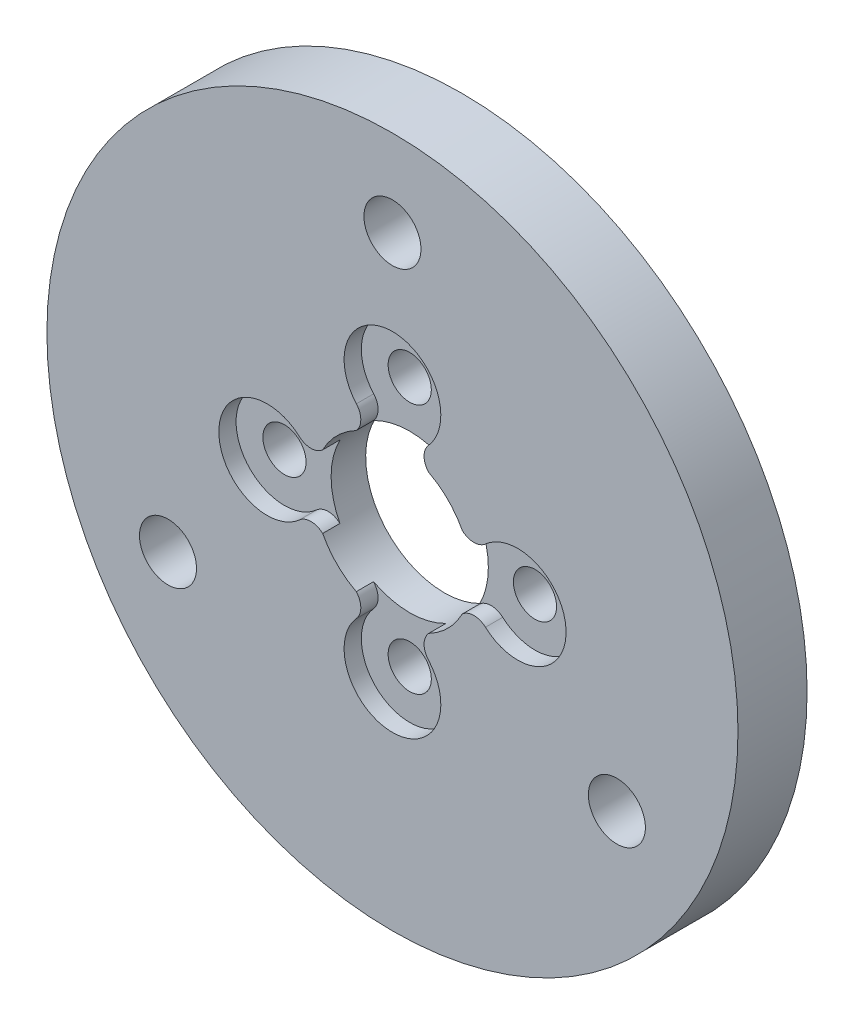
ISO-10303-21;
HEADER;
FILE_DESCRIPTION(('STEP AP214'),'2;1');
FILE_NAME('part.step','',(''),(''),'','','');
FILE_SCHEMA(('AUTOMOTIVE_DESIGN { 1 0 10303 214 1 1 1 1 }'));
ENDSEC;
DATA;
#1=APPLICATION_CONTEXT('core data for automotive mechanical design processes');
#2=APPLICATION_PROTOCOL_DEFINITION('international standard','automotive_design',2000,#1);
#3=PRODUCT_CONTEXT('',#1,'mechanical');
#4=PRODUCT('Part','Part','',(#3));
#5=PRODUCT_RELATED_PRODUCT_CATEGORY('part','',(#4));
#6=PRODUCT_DEFINITION_FORMATION('','',#4);
#7=PRODUCT_DEFINITION_CONTEXT('part definition',#1,'design');
#8=PRODUCT_DEFINITION('design','',#6,#7);
#9=PRODUCT_DEFINITION_SHAPE('','',#8);
#10=(LENGTH_UNIT() NAMED_UNIT(*) SI_UNIT(.MILLI.,.METRE.));
#11=(NAMED_UNIT(*) PLANE_ANGLE_UNIT() SI_UNIT($,.RADIAN.));
#12=(NAMED_UNIT(*) SI_UNIT($,.STERADIAN.) SOLID_ANGLE_UNIT());
#13=UNCERTAINTY_MEASURE_WITH_UNIT(LENGTH_MEASURE(1.E-05),#10,'distance_accuracy_value','');
#14=(GEOMETRIC_REPRESENTATION_CONTEXT(3) GLOBAL_UNCERTAINTY_ASSIGNED_CONTEXT((#13)) GLOBAL_UNIT_ASSIGNED_CONTEXT((#10,
#11,#12)) REPRESENTATION_CONTEXT('',''));
#15=CARTESIAN_POINT('',(0.,0.,0.));
#16=DIRECTION('',(0.,0.,1.));
#17=DIRECTION('',(1.,0.,0.));
#18=AXIS2_PLACEMENT_3D('',#15,#16,#17);
#19=CARTESIAN_POINT('',(0.,0.,3.));
#20=DIRECTION('',(0.,0.,-1.));
#21=DIRECTION('',(-1.,0.,0.));
#22=AXIS2_PLACEMENT_3D('',#19,#20,#21);
#23=CYLINDRICAL_SURFACE('',#22,20.);
#24=CARTESIAN_POINT('',(0.,0.,3.));
#25=DIRECTION('',(0.,0.,1.));
#26=DIRECTION('',(1.,0.,0.));
#27=AXIS2_PLACEMENT_3D('',#24,#25,#26);
#28=CIRCLE('',#27,20.);
#29=CARTESIAN_POINT('',(20.,0.,3.));
#30=VERTEX_POINT('',#29);
#31=EDGE_CURVE('E252',#30,#30,#28,.T.);
#32=ORIENTED_EDGE('',*,*,#31,.F.);
#33=EDGE_LOOP('',(#32));
#34=FACE_BOUND('',#33,.T.);
#35=CARTESIAN_POINT('',(0.,0.,-1.));
#36=DIRECTION('',(0.,0.,-1.));
#37=DIRECTION('',(-1.,0.,0.));
#38=AXIS2_PLACEMENT_3D('',#35,#36,#37);
#39=CIRCLE('',#38,20.);
#40=CARTESIAN_POINT('',(-20.,0.,-1.));
#41=VERTEX_POINT('',#40);
#42=EDGE_CURVE('E371',#41,#41,#39,.T.);
#43=ORIENTED_EDGE('',*,*,#42,.F.);
#44=EDGE_LOOP('',(#43));
#45=FACE_BOUND('',#44,.T.);
#46=ADVANCED_FACE('F43',(#34,#45),#23,.T.);
#47=CARTESIAN_POINT('',(0.,0.,-1.));
#48=DIRECTION('',(0.,0.,1.));
#49=DIRECTION('',(1.,0.,0.));
#50=AXIS2_PLACEMENT_3D('',#47,#48,#49);
#51=CYLINDRICAL_SURFACE('',#50,9.5);
#52=CARTESIAN_POINT('',(0.,0.,0.));
#53=DIRECTION('',(0.,0.,1.));
#54=DIRECTION('',(1.,0.,0.));
#55=AXIS2_PLACEMENT_3D('',#52,#53,#54);
#56=CIRCLE('',#55,9.5);
#57=CARTESIAN_POINT('',(9.5,0.,0.));
#58=VERTEX_POINT('',#57);
#59=EDGE_CURVE('E287',#58,#58,#56,.F.);
#60=ORIENTED_EDGE('',*,*,#59,.F.);
#61=EDGE_LOOP('',(#60));
#62=FACE_BOUND('',#61,.T.);
#63=CARTESIAN_POINT('',(0.,0.,-1.));
#64=DIRECTION('',(0.,0.,-1.));
#65=DIRECTION('',(-1.,0.,0.));
#66=AXIS2_PLACEMENT_3D('',#63,#64,#65);
#67=CIRCLE('',#66,9.5);
#68=CARTESIAN_POINT('',(-9.5,0.,-1.));
#69=VERTEX_POINT('',#68);
#70=EDGE_CURVE('E292',#69,#69,#67,.T.);
#71=ORIENTED_EDGE('',*,*,#70,.T.);
#72=EDGE_LOOP('',(#71));
#73=FACE_BOUND('',#72,.T.);
#74=ADVANCED_FACE('F342',(#62,#73),#51,.F.);
#75=CARTESIAN_POINT('',(0.,0.,0.));
#76=DIRECTION('',(0.,0.,1.));
#77=DIRECTION('',(1.,0.,0.));
#78=AXIS2_PLACEMENT_3D('',#75,#76,#77);
#79=PLANE('',#78);
#80=CARTESIAN_POINT('',(0.,0.,0.));
#81=DIRECTION('',(0.,0.,1.));
#82=DIRECTION('',(1.,0.,0.));
#83=AXIS2_PLACEMENT_3D('',#80,#81,#82);
#84=CIRCLE('',#83,4.55);
#85=CARTESIAN_POINT('',(4.55,0.,0.));
#86=VERTEX_POINT('',#85);
#87=EDGE_CURVE('E255',#86,#86,#84,.T.);
#88=ORIENTED_EDGE('',*,*,#87,.T.);
#89=EDGE_LOOP('',(#88));
#90=FACE_BOUND('',#89,.T.);
#91=CARTESIAN_POINT('',(-7.25,0.,0.));
#92=DIRECTION('',(0.,0.,1.));
#93=DIRECTION('',(1.,0.,0.));
#94=AXIS2_PLACEMENT_3D('',#91,#92,#93);
#95=CIRCLE('',#94,1.25);
#96=CARTESIAN_POINT('',(-6.,0.,0.));
#97=VERTEX_POINT('',#96);
#98=EDGE_CURVE('E262',#97,#97,#95,.T.);
#99=ORIENTED_EDGE('',*,*,#98,.T.);
#100=EDGE_LOOP('',(#99));
#101=FACE_BOUND('',#100,.T.);
#102=CARTESIAN_POINT('',(0.,-7.25,0.));
#103=DIRECTION('',(0.,0.,1.));
#104=DIRECTION('',(1.,0.,0.));
#105=AXIS2_PLACEMENT_3D('',#102,#103,#104);
#106=CIRCLE('',#105,1.25);
#107=CARTESIAN_POINT('',(1.25,-7.25,0.));
#108=VERTEX_POINT('',#107);
#109=EDGE_CURVE('E265',#108,#108,#106,.T.);
#110=ORIENTED_EDGE('',*,*,#109,.T.);
#111=EDGE_LOOP('',(#110));
#112=FACE_BOUND('',#111,.T.);
#113=CARTESIAN_POINT('',(7.25,0.,0.));
#114=DIRECTION('',(0.,0.,1.));
#115=DIRECTION('',(1.,0.,0.));
#116=AXIS2_PLACEMENT_3D('',#113,#114,#115);
#117=CIRCLE('',#116,1.25);
#118=CARTESIAN_POINT('',(8.5,0.,0.));
#119=VERTEX_POINT('',#118);
#120=EDGE_CURVE('E268',#119,#119,#117,.T.);
#121=ORIENTED_EDGE('',*,*,#120,.T.);
#122=EDGE_LOOP('',(#121));
#123=FACE_BOUND('',#122,.T.);
#124=CARTESIAN_POINT('',(0.,7.25,0.));
#125=DIRECTION('',(0.,0.,1.));
#126=DIRECTION('',(1.,0.,0.));
#127=AXIS2_PLACEMENT_3D('',#124,#125,#126);
#128=CIRCLE('',#127,1.25);
#129=CARTESIAN_POINT('',(1.25,7.25,0.));
#130=VERTEX_POINT('',#129);
#131=EDGE_CURVE('E258',#130,#130,#128,.T.);
#132=ORIENTED_EDGE('',*,*,#131,.T.);
#133=EDGE_LOOP('',(#132));
#134=FACE_BOUND('',#133,.T.);
#135=ORIENTED_EDGE('',*,*,#59,.T.);
#136=EDGE_LOOP('',(#135));
#137=FACE_BOUND('',#136,.T.);
#138=ADVANCED_FACE('F349',(#90,#101,#112,#123,#134,#137),#79,.F.);
#139=CARTESIAN_POINT('',(-7.25,0.,-8.));
#140=DIRECTION('',(0.,0.,1.));
#141=DIRECTION('',(1.,0.,0.));
#142=AXIS2_PLACEMENT_3D('',#139,#140,#141);
#143=CYLINDRICAL_SURFACE('',#142,1.25);
#144=ORIENTED_EDGE('',*,*,#98,.F.);
#145=EDGE_LOOP('',(#144));
#146=FACE_BOUND('',#145,.T.);
#147=CARTESIAN_POINT('',(-7.25,0.,2.));
#148=DIRECTION('',(0.,0.,1.));
#149=DIRECTION('',(1.,0.,0.));
#150=AXIS2_PLACEMENT_3D('',#147,#148,#149);
#151=CIRCLE('',#150,1.25);
#152=CARTESIAN_POINT('',(-6.,0.,2.));
#153=VERTEX_POINT('',#152);
#154=EDGE_CURVE('E309',#153,#153,#151,.T.);
#155=ORIENTED_EDGE('',*,*,#154,.T.);
#156=EDGE_LOOP('',(#155));
#157=FACE_BOUND('',#156,.T.);
#158=ADVANCED_FACE('F473',(#146,#157),#143,.F.);
#159=CARTESIAN_POINT('',(0.,-7.25,-8.));
#160=DIRECTION('',(0.,0.,1.));
#161=DIRECTION('',(1.,0.,0.));
#162=AXIS2_PLACEMENT_3D('',#159,#160,#161);
#163=CYLINDRICAL_SURFACE('',#162,1.25);
#164=ORIENTED_EDGE('',*,*,#109,.F.);
#165=EDGE_LOOP('',(#164));
#166=FACE_BOUND('',#165,.T.);
#167=CARTESIAN_POINT('',(0.,-7.25,2.));
#168=DIRECTION('',(0.,0.,1.));
#169=DIRECTION('',(1.,0.,0.));
#170=AXIS2_PLACEMENT_3D('',#167,#168,#169);
#171=CIRCLE('',#170,1.25);
#172=CARTESIAN_POINT('',(1.25,-7.25,2.));
#173=VERTEX_POINT('',#172);
#174=EDGE_CURVE('E204',#173,#173,#171,.T.);
#175=ORIENTED_EDGE('',*,*,#174,.T.);
#176=EDGE_LOOP('',(#175));
#177=FACE_BOUND('',#176,.T.);
#178=ADVANCED_FACE('F315',(#166,#177),#163,.F.);
#179=CARTESIAN_POINT('',(7.25,0.,-8.));
#180=DIRECTION('',(0.,0.,1.));
#181=DIRECTION('',(1.,0.,0.));
#182=AXIS2_PLACEMENT_3D('',#179,#180,#181);
#183=CYLINDRICAL_SURFACE('',#182,1.25);
#184=ORIENTED_EDGE('',*,*,#120,.F.);
#185=EDGE_LOOP('',(#184));
#186=FACE_BOUND('',#185,.T.);
#187=CARTESIAN_POINT('',(7.25,0.,2.));
#188=DIRECTION('',(0.,0.,1.));
#189=DIRECTION('',(1.,0.,0.));
#190=AXIS2_PLACEMENT_3D('',#187,#188,#189);
#191=CIRCLE('',#190,1.25);
#192=CARTESIAN_POINT('',(8.5,0.,2.));
#193=VERTEX_POINT('',#192);
#194=EDGE_CURVE('E306',#193,#193,#191,.T.);
#195=ORIENTED_EDGE('',*,*,#194,.T.);
#196=EDGE_LOOP('',(#195));
#197=FACE_BOUND('',#196,.T.);
#198=ADVANCED_FACE('F466',(#186,#197),#183,.F.);
#199=CARTESIAN_POINT('',(0.,7.25,-8.));
#200=DIRECTION('',(0.,0.,1.));
#201=DIRECTION('',(1.,0.,0.));
#202=AXIS2_PLACEMENT_3D('',#199,#200,#201);
#203=CYLINDRICAL_SURFACE('',#202,1.25);
#204=ORIENTED_EDGE('',*,*,#131,.F.);
#205=EDGE_LOOP('',(#204));
#206=FACE_BOUND('',#205,.T.);
#207=CARTESIAN_POINT('',(0.,7.25,2.));
#208=DIRECTION('',(0.,0.,1.));
#209=DIRECTION('',(1.,0.,0.));
#210=AXIS2_PLACEMENT_3D('',#207,#208,#209);
#211=CIRCLE('',#210,1.25);
#212=CARTESIAN_POINT('',(1.25,7.25,2.));
#213=VERTEX_POINT('',#212);
#214=EDGE_CURVE('E289',#213,#213,#211,.T.);
#215=ORIENTED_EDGE('',*,*,#214,.T.);
#216=EDGE_LOOP('',(#215));
#217=FACE_BOUND('',#216,.T.);
#218=ADVANCED_FACE('F425',(#206,#217),#203,.F.);
#219=CARTESIAN_POINT('',(0.,0.,3.));
#220=DIRECTION('',(0.,0.,1.));
#221=DIRECTION('',(1.,0.,0.));
#222=AXIS2_PLACEMENT_3D('',#219,#220,#221);
#223=PLANE('',#222);
#224=CARTESIAN_POINT('',(0.,15.,3.));
#225=DIRECTION('',(0.,0.,-1.));
#226=DIRECTION('',(-1.,0.,0.));
#227=AXIS2_PLACEMENT_3D('',#224,#225,#226);
#228=CIRCLE('',#227,1.65);
#229=CARTESIAN_POINT('',(-1.65,15.,3.));
#230=VERTEX_POINT('',#229);
#231=EDGE_CURVE('E373',#230,#230,#228,.T.);
#232=ORIENTED_EDGE('',*,*,#231,.T.);
#233=EDGE_LOOP('',(#232));
#234=FACE_BOUND('',#233,.T.);
#235=CARTESIAN_POINT('',(-12.9903810567701,-7.49999999999797,3.));
#236=DIRECTION('',(0.,0.,-1.));
#237=DIRECTION('',(-1.,0.,0.));
#238=AXIS2_PLACEMENT_3D('',#235,#236,#237);
#239=CIRCLE('',#238,1.65000000000284);
#240=CARTESIAN_POINT('',(-14.6403810567729,-7.49999999999797,3.));
#241=VERTEX_POINT('',#240);
#242=EDGE_CURVE('E385',#241,#241,#239,.T.);
#243=ORIENTED_EDGE('',*,*,#242,.T.);
#244=EDGE_LOOP('',(#243));
#245=FACE_BOUND('',#244,.T.);
#246=CARTESIAN_POINT('',(12.9903810567631,-7.50000000000203,3.));
#247=DIRECTION('',(0.,0.,-1.));
#248=DIRECTION('',(-1.,0.,0.));
#249=AXIS2_PLACEMENT_3D('',#246,#247,#248);
#250=CIRCLE('',#249,1.65000000000408);
#251=CARTESIAN_POINT('',(11.340381056759,-7.50000000000203,3.));
#252=VERTEX_POINT('',#251);
#253=EDGE_CURVE('E379',#252,#252,#250,.T.);
#254=ORIENTED_EDGE('',*,*,#253,.T.);
#255=EDGE_LOOP('',(#254));
#256=FACE_BOUND('',#255,.T.);
#257=CARTESIAN_POINT('',(-4.71534482758621,-2.83116992724845,3.));
#258=DIRECTION('',(0.,0.,-1.));
#259=DIRECTION('',(1.,0.,0.));
#260=AXIS2_PLACEMENT_3D('',#257,#258,#259);
#261=CIRCLE('',#260,1.);
#262=CARTESIAN_POINT('',(-5.38235934664247,-2.08612520955149,3.));
#263=VERTEX_POINT('',#262);
#264=CARTESIAN_POINT('',(-4.03939997136812,-2.09421772299616,3.));
#265=VERTEX_POINT('',#264);
#266=EDGE_CURVE('E202',#263,#265,#261,.T.);
#267=ORIENTED_EDGE('',*,*,#266,.F.);
#268=CARTESIAN_POINT('',(-7.25,0.,3.));
#269=DIRECTION('',(0.,0.,1.));
#270=DIRECTION('',(1.,0.,0.));
#271=AXIS2_PLACEMENT_3D('',#268,#269,#270);
#272=CIRCLE('',#271,2.8);
#273=CARTESIAN_POINT('',(-5.38235934664247,2.08612520955149,3.));
#274=VERTEX_POINT('',#273);
#275=EDGE_CURVE('E226',#274,#263,#272,.T.);
#276=ORIENTED_EDGE('',*,*,#275,.F.);
#277=CARTESIAN_POINT('',(-4.71534482758621,2.83116992724845,3.));
#278=DIRECTION('',(0.,0.,-1.));
#279=DIRECTION('',(-1.,0.,0.));
#280=AXIS2_PLACEMENT_3D('',#277,#278,#279);
#281=CIRCLE('',#280,1.);
#282=CARTESIAN_POINT('',(-4.03939997136812,2.09421772299616,3.));
#283=VERTEX_POINT('',#282);
#284=EDGE_CURVE('E224',#283,#274,#281,.T.);
#285=ORIENTED_EDGE('',*,*,#284,.F.);
#286=CARTESIAN_POINT('',(0.,0.,3.));
#287=DIRECTION('',(0.,0.,1.));
#288=DIRECTION('',(1.,0.,0.));
#289=AXIS2_PLACEMENT_3D('',#286,#287,#288);
#290=CIRCLE('',#289,4.55);
#291=CARTESIAN_POINT('',(-2.09421772299616,4.03939997136812,3.));
#292=VERTEX_POINT('',#291);
#293=EDGE_CURVE('E253',#292,#283,#290,.T.);
#294=ORIENTED_EDGE('',*,*,#293,.F.);
#295=CARTESIAN_POINT('',(-2.83116992724845,4.71534482758621,3.));
#296=DIRECTION('',(0.,0.,-1.));
#297=DIRECTION('',(1.,0.,0.));
#298=AXIS2_PLACEMENT_3D('',#295,#296,#297);
#299=CIRCLE('',#298,1.);
#300=CARTESIAN_POINT('',(-2.08612520955149,5.38235934664247,3.));
#301=VERTEX_POINT('',#300);
#302=EDGE_CURVE('E222',#301,#292,#299,.T.);
#303=ORIENTED_EDGE('',*,*,#302,.F.);
#304=CARTESIAN_POINT('',(0.,7.25,3.));
#305=DIRECTION('',(0.,0.,1.));
#306=DIRECTION('',(1.,0.,0.));
#307=AXIS2_PLACEMENT_3D('',#304,#305,#306);
#308=CIRCLE('',#307,2.8);
#309=CARTESIAN_POINT('',(2.08612520955149,5.38235934664247,3.));
#310=VERTEX_POINT('',#309);
#311=EDGE_CURVE('E219',#310,#301,#308,.T.);
#312=ORIENTED_EDGE('',*,*,#311,.F.);
#313=CARTESIAN_POINT('',(2.83116992724845,4.71534482758621,3.));
#314=DIRECTION('',(0.,0.,-1.));
#315=DIRECTION('',(-1.,0.,0.));
#316=AXIS2_PLACEMENT_3D('',#313,#314,#315);
#317=CIRCLE('',#316,1.);
#318=CARTESIAN_POINT('',(2.09421772299616,4.03939997136812,3.));
#319=VERTEX_POINT('',#318);
#320=EDGE_CURVE('E217',#319,#310,#317,.T.);
#321=ORIENTED_EDGE('',*,*,#320,.F.);
#322=CARTESIAN_POINT('',(4.03939997136812,2.09421772299616,3.));
#323=VERTEX_POINT('',#322);
#324=EDGE_CURVE('E249',#323,#319,#290,.T.);
#325=ORIENTED_EDGE('',*,*,#324,.F.);
#326=CARTESIAN_POINT('',(4.71534482758621,2.83116992724845,3.));
#327=DIRECTION('',(0.,0.,-1.));
#328=DIRECTION('',(1.,0.,0.));
#329=AXIS2_PLACEMENT_3D('',#326,#327,#328);
#330=CIRCLE('',#329,1.);
#331=CARTESIAN_POINT('',(5.38235934664247,2.08612520955149,3.));
#332=VERTEX_POINT('',#331);
#333=EDGE_CURVE('E215',#332,#323,#330,.T.);
#334=ORIENTED_EDGE('',*,*,#333,.F.);
#335=CARTESIAN_POINT('',(7.25,0.,3.));
#336=DIRECTION('',(0.,0.,1.));
#337=DIRECTION('',(1.,0.,0.));
#338=AXIS2_PLACEMENT_3D('',#335,#336,#337);
#339=CIRCLE('',#338,2.8);
#340=CARTESIAN_POINT('',(5.38235934664247,-2.08612520955149,3.));
#341=VERTEX_POINT('',#340);
#342=EDGE_CURVE('E212',#341,#332,#339,.T.);
#343=ORIENTED_EDGE('',*,*,#342,.F.);
#344=CARTESIAN_POINT('',(4.71534482758621,-2.83116992724845,3.));
#345=DIRECTION('',(0.,0.,-1.));
#346=DIRECTION('',(-1.,0.,0.));
#347=AXIS2_PLACEMENT_3D('',#344,#345,#346);
#348=CIRCLE('',#347,1.);
#349=CARTESIAN_POINT('',(4.03939997136812,-2.09421772299616,3.));
#350=VERTEX_POINT('',#349);
#351=EDGE_CURVE('E210',#350,#341,#348,.T.);
#352=ORIENTED_EDGE('',*,*,#351,.F.);
#353=CARTESIAN_POINT('',(2.09421772299616,-4.03939997136812,3.));
#354=VERTEX_POINT('',#353);
#355=EDGE_CURVE('E254',#354,#350,#290,.T.);
#356=ORIENTED_EDGE('',*,*,#355,.F.);
#357=CARTESIAN_POINT('',(2.83116992724845,-4.71534482758621,3.));
#358=DIRECTION('',(0.,0.,-1.));
#359=DIRECTION('',(-1.,0.,0.));
#360=AXIS2_PLACEMENT_3D('',#357,#358,#359);
#361=CIRCLE('',#360,1.);
#362=CARTESIAN_POINT('',(2.08612520955149,-5.38235934664247,3.));
#363=VERTEX_POINT('',#362);
#364=EDGE_CURVE('E208',#363,#354,#361,.T.);
#365=ORIENTED_EDGE('',*,*,#364,.F.);
#366=CARTESIAN_POINT('',(0.,-7.25,3.));
#367=DIRECTION('',(0.,0.,1.));
#368=DIRECTION('',(1.,0.,0.));
#369=AXIS2_PLACEMENT_3D('',#366,#367,#368);
#370=CIRCLE('',#369,2.8);
#371=CARTESIAN_POINT('',(-2.08612520955149,-5.38235934664247,3.));
#372=VERTEX_POINT('',#371);
#373=EDGE_CURVE('E206',#372,#363,#370,.T.);
#374=ORIENTED_EDGE('',*,*,#373,.F.);
#375=CARTESIAN_POINT('',(-2.83116992724845,-4.71534482758621,3.));
#376=DIRECTION('',(0.,0.,-1.));
#377=DIRECTION('',(1.,0.,0.));
#378=AXIS2_PLACEMENT_3D('',#375,#376,#377);
#379=CIRCLE('',#378,1.);
#380=CARTESIAN_POINT('',(-2.09421772299616,-4.03939997136812,3.));
#381=VERTEX_POINT('',#380);
#382=EDGE_CURVE('E173',#381,#372,#379,.T.);
#383=ORIENTED_EDGE('',*,*,#382,.F.);
#384=EDGE_CURVE('E435',#265,#381,#290,.T.);
#385=ORIENTED_EDGE('',*,*,#384,.F.);
#386=EDGE_LOOP('',(#267,#276,#285,#294,#303,#312,#321,#325,#334,#343,#352,#356,#365,#374,#383,#385));
#387=FACE_BOUND('',#386,.T.);
#388=ORIENTED_EDGE('',*,*,#31,.T.);
#389=EDGE_LOOP('',(#388));
#390=FACE_BOUND('',#389,.T.);
#391=ADVANCED_FACE('F421',(#234,#245,#256,#387,#390),#223,.T.);
#392=CARTESIAN_POINT('',(0.,0.,3.));
#393=DIRECTION('',(0.,0.,-1.));
#394=DIRECTION('',(-1.,0.,0.));
#395=AXIS2_PLACEMENT_3D('',#392,#393,#394);
#396=CYLINDRICAL_SURFACE('',#395,4.55);
#397=DIRECTION('',(0.,0.,1.));
#398=VECTOR('',#397,1.);
#399=CARTESIAN_POINT('',(-2.09421772299616,4.03939997136812,2.5));
#400=LINE('',#399,#398);
#401=CARTESIAN_POINT('',(-2.09421772299616,4.03939997136812,2.));
#402=VERTEX_POINT('',#401);
#403=EDGE_CURVE('E11',#292,#402,#400,.F.);
#404=ORIENTED_EDGE('',*,*,#403,.F.);
#405=ORIENTED_EDGE('',*,*,#293,.T.);
#406=DIRECTION('',(0.,0.,1.));
#407=VECTOR('',#406,1.);
#408=CARTESIAN_POINT('',(-4.03939997136812,2.09421772299616,2.5));
#409=LINE('',#408,#407);
#410=CARTESIAN_POINT('',(-4.03939997136812,2.09421772299616,2.));
#411=VERTEX_POINT('',#410);
#412=EDGE_CURVE('E282',#411,#283,#409,.T.);
#413=ORIENTED_EDGE('',*,*,#412,.F.);
#414=CARTESIAN_POINT('',(0.,0.,2.));
#415=DIRECTION('',(0.,0.,1.));
#416=DIRECTION('',(1.,0.,0.));
#417=AXIS2_PLACEMENT_3D('',#414,#415,#416);
#418=CIRCLE('',#417,4.55);
#419=CARTESIAN_POINT('',(-4.03939997136812,-2.09421772299616,2.));
#420=VERTEX_POINT('',#419);
#421=EDGE_CURVE('E443',#411,#420,#418,.T.);
#422=ORIENTED_EDGE('',*,*,#421,.T.);
#423=DIRECTION('',(0.,0.,1.));
#424=VECTOR('',#423,1.);
#425=CARTESIAN_POINT('',(-4.03939997136812,-2.09421772299616,2.5));
#426=LINE('',#425,#424);
#427=EDGE_CURVE('E284',#265,#420,#426,.F.);
#428=ORIENTED_EDGE('',*,*,#427,.F.);
#429=ORIENTED_EDGE('',*,*,#384,.T.);
#430=DIRECTION('',(0.,0.,1.));
#431=VECTOR('',#430,1.);
#432=CARTESIAN_POINT('',(-2.09421772299616,-4.03939997136812,2.5));
#433=LINE('',#432,#431);
#434=CARTESIAN_POINT('',(-2.09421772299616,-4.03939997136812,2.));
#435=VERTEX_POINT('',#434);
#436=EDGE_CURVE('E277',#435,#381,#433,.T.);
#437=ORIENTED_EDGE('',*,*,#436,.F.);
#438=CARTESIAN_POINT('',(2.09421772299616,-4.03939997136812,2.));
#439=VERTEX_POINT('',#438);
#440=EDGE_CURVE('E165',#435,#439,#418,.T.);
#441=ORIENTED_EDGE('',*,*,#440,.T.);
#442=DIRECTION('',(0.,0.,1.));
#443=VECTOR('',#442,1.);
#444=CARTESIAN_POINT('',(2.09421772299616,-4.03939997136812,2.5));
#445=LINE('',#444,#443);
#446=EDGE_CURVE('E279',#354,#439,#445,.F.);
#447=ORIENTED_EDGE('',*,*,#446,.F.);
#448=ORIENTED_EDGE('',*,*,#355,.T.);
#449=DIRECTION('',(0.,0.,1.));
#450=VECTOR('',#449,1.);
#451=CARTESIAN_POINT('',(4.03939997136812,-2.09421772299616,2.5));
#452=LINE('',#451,#450);
#453=CARTESIAN_POINT('',(4.03939997136812,-2.09421772299616,2.));
#454=VERTEX_POINT('',#453);
#455=EDGE_CURVE('E261',#454,#350,#452,.T.);
#456=ORIENTED_EDGE('',*,*,#455,.F.);
#457=CARTESIAN_POINT('',(4.03939997136812,2.09421772299616,2.));
#458=VERTEX_POINT('',#457);
#459=EDGE_CURVE('E231',#454,#458,#418,.T.);
#460=ORIENTED_EDGE('',*,*,#459,.T.);
#461=DIRECTION('',(0.,0.,1.));
#462=VECTOR('',#461,1.);
#463=CARTESIAN_POINT('',(4.03939997136812,2.09421772299616,2.5));
#464=LINE('',#463,#462);
#465=EDGE_CURVE('E274',#323,#458,#464,.F.);
#466=ORIENTED_EDGE('',*,*,#465,.F.);
#467=ORIENTED_EDGE('',*,*,#324,.T.);
#468=DIRECTION('',(0.,0.,1.));
#469=VECTOR('',#468,1.);
#470=CARTESIAN_POINT('',(2.09421772299616,4.03939997136812,2.5));
#471=LINE('',#470,#469);
#472=CARTESIAN_POINT('',(2.09421772299616,4.03939997136812,2.));
#473=VERTEX_POINT('',#472);
#474=EDGE_CURVE('E52',#473,#319,#471,.T.);
#475=ORIENTED_EDGE('',*,*,#474,.F.);
#476=EDGE_CURVE('E248',#473,#402,#418,.T.);
#477=ORIENTED_EDGE('',*,*,#476,.T.);
#478=EDGE_LOOP('',(#404,#405,#413,#422,#428,#429,#437,#441,#447,#448,#456,#460,#466,#467,#475,#477));
#479=FACE_BOUND('',#478,.T.);
#480=ORIENTED_EDGE('',*,*,#87,.F.);
#481=EDGE_LOOP('',(#480));
#482=FACE_BOUND('',#481,.T.);
#483=ADVANCED_FACE('F424',(#479,#482),#396,.F.);
#484=CARTESIAN_POINT('',(-5.9826724137931,-1.41558496362423,2.));
#485=DIRECTION('',(0.,0.,1.));
#486=DIRECTION('',(1.,0.,0.));
#487=AXIS2_PLACEMENT_3D('',#484,#485,#486);
#488=PLANE('',#487);
#489=ORIENTED_EDGE('',*,*,#214,.F.);
#490=EDGE_LOOP('',(#489));
#491=FACE_BOUND('',#490,.T.);
#492=CARTESIAN_POINT('',(2.83116992724845,4.71534482758621,2.));
#493=DIRECTION('',(0.,0.,-1.));
#494=DIRECTION('',(-1.,0.,0.));
#495=AXIS2_PLACEMENT_3D('',#492,#493,#494);
#496=CIRCLE('',#495,1.);
#497=CARTESIAN_POINT('',(2.08612520955149,5.38235934664247,2.));
#498=VERTEX_POINT('',#497);
#499=EDGE_CURVE('E194',#473,#498,#496,.T.);
#500=ORIENTED_EDGE('',*,*,#499,.T.);
#501=CARTESIAN_POINT('',(0.,7.25,2.));
#502=DIRECTION('',(0.,0.,1.));
#503=DIRECTION('',(1.,0.,0.));
#504=AXIS2_PLACEMENT_3D('',#501,#502,#503);
#505=CIRCLE('',#504,2.8);
#506=CARTESIAN_POINT('',(-2.08612520955149,5.38235934664247,2.));
#507=VERTEX_POINT('',#506);
#508=EDGE_CURVE('E196',#498,#507,#505,.T.);
#509=ORIENTED_EDGE('',*,*,#508,.T.);
#510=CARTESIAN_POINT('',(-2.83116992724845,4.71534482758621,2.));
#511=DIRECTION('',(0.,0.,-1.));
#512=DIRECTION('',(1.,0.,0.));
#513=AXIS2_PLACEMENT_3D('',#510,#511,#512);
#514=CIRCLE('',#513,1.);
#515=EDGE_CURVE('E60',#507,#402,#514,.T.);
#516=ORIENTED_EDGE('',*,*,#515,.T.);
#517=ORIENTED_EDGE('',*,*,#476,.F.);
#518=EDGE_LOOP('',(#500,#509,#516,#517));
#519=FACE_BOUND('',#518,.T.);
#520=ADVANCED_FACE('F337',(#491,#519),#488,.T.);
#521=CARTESIAN_POINT('',(2.83116992724845,4.71534482758621,2.));
#522=DIRECTION('',(0.,0.,1.));
#523=DIRECTION('',(1.,0.,0.));
#524=AXIS2_PLACEMENT_3D('',#521,#522,#523);
#525=CYLINDRICAL_SURFACE('',#524,1.);
#526=ORIENTED_EDGE('',*,*,#474,.T.);
#527=ORIENTED_EDGE('',*,*,#320,.T.);
#528=DIRECTION('',(0.,0.,1.));
#529=VECTOR('',#528,1.);
#530=CARTESIAN_POINT('',(2.08612520955149,5.38235934664247,2.));
#531=LINE('',#530,#529);
#532=EDGE_CURVE('E237',#498,#310,#531,.T.);
#533=ORIENTED_EDGE('',*,*,#532,.F.);
#534=ORIENTED_EDGE('',*,*,#499,.F.);
#535=EDGE_LOOP('',(#526,#527,#533,#534));
#536=FACE_BOUND('',#535,.T.);
#537=ADVANCED_FACE('F482',(#536),#525,.T.);
#538=CARTESIAN_POINT('',(-2.83116992724845,4.71534482758621,2.));
#539=DIRECTION('',(0.,0.,1.));
#540=DIRECTION('',(1.,0.,0.));
#541=AXIS2_PLACEMENT_3D('',#538,#539,#540);
#542=CYLINDRICAL_SURFACE('',#541,1.);
#543=ORIENTED_EDGE('',*,*,#403,.T.);
#544=ORIENTED_EDGE('',*,*,#515,.F.);
#545=DIRECTION('',(0.,0.,1.));
#546=VECTOR('',#545,1.);
#547=CARTESIAN_POINT('',(-2.08612520955149,5.38235934664247,2.));
#548=LINE('',#547,#546);
#549=EDGE_CURVE('E235',#507,#301,#548,.T.);
#550=ORIENTED_EDGE('',*,*,#549,.T.);
#551=ORIENTED_EDGE('',*,*,#302,.T.);
#552=EDGE_LOOP('',(#543,#544,#550,#551));
#553=FACE_BOUND('',#552,.T.);
#554=ADVANCED_FACE('F487',(#553),#542,.T.);
#555=CARTESIAN_POINT('',(0.,7.25,2.));
#556=DIRECTION('',(0.,0.,1.));
#557=DIRECTION('',(1.,0.,0.));
#558=AXIS2_PLACEMENT_3D('',#555,#556,#557);
#559=CYLINDRICAL_SURFACE('',#558,2.8);
#560=ORIENTED_EDGE('',*,*,#311,.T.);
#561=ORIENTED_EDGE('',*,*,#549,.F.);
#562=ORIENTED_EDGE('',*,*,#508,.F.);
#563=ORIENTED_EDGE('',*,*,#532,.T.);
#564=EDGE_LOOP('',(#560,#561,#562,#563));
#565=FACE_BOUND('',#564,.T.);
#566=ADVANCED_FACE('F335',(#565),#559,.F.);
#567=ORIENTED_EDGE('',*,*,#194,.F.);
#568=EDGE_LOOP('',(#567));
#569=FACE_BOUND('',#568,.T.);
#570=CARTESIAN_POINT('',(4.71534482758621,-2.83116992724845,2.));
#571=DIRECTION('',(0.,0.,-1.));
#572=DIRECTION('',(-1.,0.,0.));
#573=AXIS2_PLACEMENT_3D('',#570,#571,#572);
#574=CIRCLE('',#573,1.);
#575=CARTESIAN_POINT('',(5.38235934664247,-2.08612520955149,2.));
#576=VERTEX_POINT('',#575);
#577=EDGE_CURVE('E184',#454,#576,#574,.T.);
#578=ORIENTED_EDGE('',*,*,#577,.T.);
#579=CARTESIAN_POINT('',(7.25,0.,2.));
#580=DIRECTION('',(0.,0.,1.));
#581=DIRECTION('',(1.,0.,0.));
#582=AXIS2_PLACEMENT_3D('',#579,#580,#581);
#583=CIRCLE('',#582,2.8);
#584=CARTESIAN_POINT('',(5.38235934664247,2.08612520955149,2.));
#585=VERTEX_POINT('',#584);
#586=EDGE_CURVE('E189',#576,#585,#583,.T.);
#587=ORIENTED_EDGE('',*,*,#586,.T.);
#588=CARTESIAN_POINT('',(4.71534482758621,2.83116992724845,2.));
#589=DIRECTION('',(0.,0.,-1.));
#590=DIRECTION('',(1.,0.,0.));
#591=AXIS2_PLACEMENT_3D('',#588,#589,#590);
#592=CIRCLE('',#591,1.);
#593=EDGE_CURVE('E192',#585,#458,#592,.T.);
#594=ORIENTED_EDGE('',*,*,#593,.T.);
#595=ORIENTED_EDGE('',*,*,#459,.F.);
#596=EDGE_LOOP('',(#578,#587,#594,#595));
#597=FACE_BOUND('',#596,.T.);
#598=ADVANCED_FACE('F320',(#569,#597),#488,.T.);
#599=CARTESIAN_POINT('',(4.71534482758621,-2.83116992724845,2.));
#600=DIRECTION('',(0.,0.,1.));
#601=DIRECTION('',(1.,0.,0.));
#602=AXIS2_PLACEMENT_3D('',#599,#600,#601);
#603=CYLINDRICAL_SURFACE('',#602,1.);
#604=ORIENTED_EDGE('',*,*,#455,.T.);
#605=ORIENTED_EDGE('',*,*,#351,.T.);
#606=DIRECTION('',(0.,0.,1.));
#607=VECTOR('',#606,1.);
#608=CARTESIAN_POINT('',(5.38235934664247,-2.08612520955149,2.));
#609=LINE('',#608,#607);
#610=EDGE_CURVE('E242',#576,#341,#609,.T.);
#611=ORIENTED_EDGE('',*,*,#610,.F.);
#612=ORIENTED_EDGE('',*,*,#577,.F.);
#613=EDGE_LOOP('',(#604,#605,#611,#612));
#614=FACE_BOUND('',#613,.T.);
#615=ADVANCED_FACE('F334',(#614),#603,.T.);
#616=CARTESIAN_POINT('',(4.71534482758621,2.83116992724845,2.));
#617=DIRECTION('',(0.,0.,1.));
#618=DIRECTION('',(1.,0.,0.));
#619=AXIS2_PLACEMENT_3D('',#616,#617,#618);
#620=CYLINDRICAL_SURFACE('',#619,1.);
#621=ORIENTED_EDGE('',*,*,#465,.T.);
#622=ORIENTED_EDGE('',*,*,#593,.F.);
#623=DIRECTION('',(0.,0.,1.));
#624=VECTOR('',#623,1.);
#625=CARTESIAN_POINT('',(5.38235934664247,2.08612520955149,2.));
#626=LINE('',#625,#624);
#627=EDGE_CURVE('E240',#585,#332,#626,.T.);
#628=ORIENTED_EDGE('',*,*,#627,.T.);
#629=ORIENTED_EDGE('',*,*,#333,.T.);
#630=EDGE_LOOP('',(#621,#622,#628,#629));
#631=FACE_BOUND('',#630,.T.);
#632=ADVANCED_FACE('F328',(#631),#620,.T.);
#633=CARTESIAN_POINT('',(7.25,0.,2.));
#634=DIRECTION('',(0.,0.,1.));
#635=DIRECTION('',(1.,0.,0.));
#636=AXIS2_PLACEMENT_3D('',#633,#634,#635);
#637=CYLINDRICAL_SURFACE('',#636,2.8);
#638=ORIENTED_EDGE('',*,*,#342,.T.);
#639=ORIENTED_EDGE('',*,*,#627,.F.);
#640=ORIENTED_EDGE('',*,*,#586,.F.);
#641=ORIENTED_EDGE('',*,*,#610,.T.);
#642=EDGE_LOOP('',(#638,#639,#640,#641));
#643=FACE_BOUND('',#642,.T.);
#644=ADVANCED_FACE('F318',(#643),#637,.F.);
#645=ORIENTED_EDGE('',*,*,#174,.F.);
#646=EDGE_LOOP('',(#645));
#647=FACE_BOUND('',#646,.T.);
#648=CARTESIAN_POINT('',(-2.83116992724845,-4.71534482758621,2.));
#649=DIRECTION('',(0.,0.,-1.));
#650=DIRECTION('',(1.,0.,0.));
#651=AXIS2_PLACEMENT_3D('',#648,#649,#650);
#652=CIRCLE('',#651,1.);
#653=CARTESIAN_POINT('',(-2.08612520955149,-5.38235934664247,2.));
#654=VERTEX_POINT('',#653);
#655=EDGE_CURVE('E159',#435,#654,#652,.T.);
#656=ORIENTED_EDGE('',*,*,#655,.T.);
#657=CARTESIAN_POINT('',(0.,-7.25,2.));
#658=DIRECTION('',(0.,0.,1.));
#659=DIRECTION('',(1.,0.,0.));
#660=AXIS2_PLACEMENT_3D('',#657,#658,#659);
#661=CIRCLE('',#660,2.8);
#662=CARTESIAN_POINT('',(2.08612520955149,-5.38235934664247,2.));
#663=VERTEX_POINT('',#662);
#664=EDGE_CURVE('E163',#654,#663,#661,.T.);
#665=ORIENTED_EDGE('',*,*,#664,.T.);
#666=CARTESIAN_POINT('',(2.83116992724845,-4.71534482758621,2.));
#667=DIRECTION('',(0.,0.,-1.));
#668=DIRECTION('',(-1.,0.,0.));
#669=AXIS2_PLACEMENT_3D('',#666,#667,#668);
#670=CIRCLE('',#669,1.);
#671=EDGE_CURVE('E182',#663,#439,#670,.T.);
#672=ORIENTED_EDGE('',*,*,#671,.T.);
#673=ORIENTED_EDGE('',*,*,#440,.F.);
#674=EDGE_LOOP('',(#656,#665,#672,#673));
#675=FACE_BOUND('',#674,.T.);
#676=ADVANCED_FACE('F161',(#647,#675),#488,.T.);
#677=CARTESIAN_POINT('',(-2.83116992724845,-4.71534482758621,2.));
#678=DIRECTION('',(0.,0.,1.));
#679=DIRECTION('',(1.,0.,0.));
#680=AXIS2_PLACEMENT_3D('',#677,#678,#679);
#681=CYLINDRICAL_SURFACE('',#680,1.);
#682=ORIENTED_EDGE('',*,*,#436,.T.);
#683=ORIENTED_EDGE('',*,*,#382,.T.);
#684=DIRECTION('',(0.,0.,1.));
#685=VECTOR('',#684,1.);
#686=CARTESIAN_POINT('',(-2.08612520955149,-5.38235934664247,2.));
#687=LINE('',#686,#685);
#688=EDGE_CURVE('E170',#654,#372,#687,.T.);
#689=ORIENTED_EDGE('',*,*,#688,.F.);
#690=ORIENTED_EDGE('',*,*,#655,.F.);
#691=EDGE_LOOP('',(#682,#683,#689,#690));
#692=FACE_BOUND('',#691,.T.);
#693=ADVANCED_FACE('F171',(#692),#681,.T.);
#694=CARTESIAN_POINT('',(2.83116992724845,-4.71534482758621,2.));
#695=DIRECTION('',(0.,0.,1.));
#696=DIRECTION('',(1.,0.,0.));
#697=AXIS2_PLACEMENT_3D('',#694,#695,#696);
#698=CYLINDRICAL_SURFACE('',#697,1.);
#699=ORIENTED_EDGE('',*,*,#446,.T.);
#700=ORIENTED_EDGE('',*,*,#671,.F.);
#701=DIRECTION('',(0.,0.,1.));
#702=VECTOR('',#701,1.);
#703=CARTESIAN_POINT('',(2.08612520955149,-5.38235934664247,2.));
#704=LINE('',#703,#702);
#705=EDGE_CURVE('E177',#663,#363,#704,.T.);
#706=ORIENTED_EDGE('',*,*,#705,.T.);
#707=ORIENTED_EDGE('',*,*,#364,.T.);
#708=EDGE_LOOP('',(#699,#700,#706,#707));
#709=FACE_BOUND('',#708,.T.);
#710=ADVANCED_FACE('F326',(#709),#698,.T.);
#711=CARTESIAN_POINT('',(0.,-7.25,2.));
#712=DIRECTION('',(0.,0.,1.));
#713=DIRECTION('',(1.,0.,0.));
#714=AXIS2_PLACEMENT_3D('',#711,#712,#713);
#715=CYLINDRICAL_SURFACE('',#714,2.8);
#716=ORIENTED_EDGE('',*,*,#373,.T.);
#717=ORIENTED_EDGE('',*,*,#705,.F.);
#718=ORIENTED_EDGE('',*,*,#664,.F.);
#719=ORIENTED_EDGE('',*,*,#688,.T.);
#720=EDGE_LOOP('',(#716,#717,#718,#719));
#721=FACE_BOUND('',#720,.T.);
#722=ADVANCED_FACE('F180',(#721),#715,.F.);
#723=ORIENTED_EDGE('',*,*,#154,.F.);
#724=EDGE_LOOP('',(#723));
#725=FACE_BOUND('',#724,.T.);
#726=CARTESIAN_POINT('',(-4.71534482758621,2.83116992724845,2.));
#727=DIRECTION('',(0.,0.,-1.));
#728=DIRECTION('',(-1.,0.,0.));
#729=AXIS2_PLACEMENT_3D('',#726,#727,#728);
#730=CIRCLE('',#729,1.);
#731=CARTESIAN_POINT('',(-5.38235934664247,2.08612520955149,2.));
#732=VERTEX_POINT('',#731);
#733=EDGE_CURVE('E199',#411,#732,#730,.T.);
#734=ORIENTED_EDGE('',*,*,#733,.T.);
#735=CARTESIAN_POINT('',(-7.25,0.,2.));
#736=DIRECTION('',(0.,0.,1.));
#737=DIRECTION('',(1.,0.,0.));
#738=AXIS2_PLACEMENT_3D('',#735,#736,#737);
#739=CIRCLE('',#738,2.8);
#740=CARTESIAN_POINT('',(-5.38235934664247,-2.08612520955149,2.));
#741=VERTEX_POINT('',#740);
#742=EDGE_CURVE('E178',#732,#741,#739,.T.);
#743=ORIENTED_EDGE('',*,*,#742,.T.);
#744=CARTESIAN_POINT('',(-4.71534482758621,-2.83116992724845,2.));
#745=DIRECTION('',(0.,0.,-1.));
#746=DIRECTION('',(1.,0.,0.));
#747=AXIS2_PLACEMENT_3D('',#744,#745,#746);
#748=CIRCLE('',#747,1.);
#749=EDGE_CURVE('E67',#741,#420,#748,.T.);
#750=ORIENTED_EDGE('',*,*,#749,.T.);
#751=ORIENTED_EDGE('',*,*,#421,.F.);
#752=EDGE_LOOP('',(#734,#743,#750,#751));
#753=FACE_BOUND('',#752,.T.);
#754=ADVANCED_FACE('F321',(#725,#753),#488,.T.);
#755=CARTESIAN_POINT('',(-4.71534482758621,-2.83116992724845,2.));
#756=DIRECTION('',(0.,0.,1.));
#757=DIRECTION('',(1.,0.,0.));
#758=AXIS2_PLACEMENT_3D('',#755,#756,#757);
#759=CYLINDRICAL_SURFACE('',#758,1.);
#760=ORIENTED_EDGE('',*,*,#427,.T.);
#761=ORIENTED_EDGE('',*,*,#749,.F.);
#762=DIRECTION('',(0.,0.,1.));
#763=VECTOR('',#762,1.);
#764=CARTESIAN_POINT('',(-5.38235934664247,-2.08612520955149,2.));
#765=LINE('',#764,#763);
#766=EDGE_CURVE('E229',#741,#263,#765,.T.);
#767=ORIENTED_EDGE('',*,*,#766,.T.);
#768=ORIENTED_EDGE('',*,*,#266,.T.);
#769=EDGE_LOOP('',(#760,#761,#767,#768));
#770=FACE_BOUND('',#769,.T.);
#771=ADVANCED_FACE('F339',(#770),#759,.T.);
#772=CARTESIAN_POINT('',(-7.25,0.,2.));
#773=DIRECTION('',(0.,0.,1.));
#774=DIRECTION('',(1.,0.,0.));
#775=AXIS2_PLACEMENT_3D('',#772,#773,#774);
#776=CYLINDRICAL_SURFACE('',#775,2.8);
#777=ORIENTED_EDGE('',*,*,#275,.T.);
#778=ORIENTED_EDGE('',*,*,#766,.F.);
#779=ORIENTED_EDGE('',*,*,#742,.F.);
#780=DIRECTION('',(0.,0.,1.));
#781=VECTOR('',#780,1.);
#782=CARTESIAN_POINT('',(-5.38235934664247,2.08612520955149,2.));
#783=LINE('',#782,#781);
#784=EDGE_CURVE('E232',#732,#274,#783,.T.);
#785=ORIENTED_EDGE('',*,*,#784,.T.);
#786=EDGE_LOOP('',(#777,#778,#779,#785));
#787=FACE_BOUND('',#786,.T.);
#788=ADVANCED_FACE('F463',(#787),#776,.F.);
#789=CARTESIAN_POINT('',(-4.71534482758621,2.83116992724845,2.));
#790=DIRECTION('',(0.,0.,1.));
#791=DIRECTION('',(1.,0.,0.));
#792=AXIS2_PLACEMENT_3D('',#789,#790,#791);
#793=CYLINDRICAL_SURFACE('',#792,1.);
#794=ORIENTED_EDGE('',*,*,#412,.T.);
#795=ORIENTED_EDGE('',*,*,#284,.T.);
#796=ORIENTED_EDGE('',*,*,#784,.F.);
#797=ORIENTED_EDGE('',*,*,#733,.F.);
#798=EDGE_LOOP('',(#794,#795,#796,#797));
#799=FACE_BOUND('',#798,.T.);
#800=ADVANCED_FACE('F398',(#799),#793,.T.);
#801=CARTESIAN_POINT('',(0.,0.,-1.));
#802=DIRECTION('',(0.,0.,-1.));
#803=DIRECTION('',(-1.,0.,0.));
#804=AXIS2_PLACEMENT_3D('',#801,#802,#803);
#805=PLANE('',#804);
#806=CARTESIAN_POINT('',(0.,15.,-1.));
#807=DIRECTION('',(0.,0.,-1.));
#808=DIRECTION('',(-1.,0.,0.));
#809=AXIS2_PLACEMENT_3D('',#806,#807,#808);
#810=CIRCLE('',#809,1.65);
#811=CARTESIAN_POINT('',(-1.65,15.,-1.));
#812=VERTEX_POINT('',#811);
#813=EDGE_CURVE('E376',#812,#812,#810,.T.);
#814=ORIENTED_EDGE('',*,*,#813,.F.);
#815=EDGE_LOOP('',(#814));
#816=FACE_BOUND('',#815,.T.);
#817=CARTESIAN_POINT('',(-12.9903810567701,-7.49999999999797,-1.));
#818=DIRECTION('',(0.,0.,-1.));
#819=DIRECTION('',(-1.,0.,0.));
#820=AXIS2_PLACEMENT_3D('',#817,#818,#819);
#821=CIRCLE('',#820,1.65000000000284);
#822=CARTESIAN_POINT('',(-14.6403810567729,-7.49999999999797,-1.));
#823=VERTEX_POINT('',#822);
#824=EDGE_CURVE('E388',#823,#823,#821,.T.);
#825=ORIENTED_EDGE('',*,*,#824,.F.);
#826=EDGE_LOOP('',(#825));
#827=FACE_BOUND('',#826,.T.);
#828=CARTESIAN_POINT('',(12.9903810567631,-7.50000000000203,-1.));
#829=DIRECTION('',(0.,0.,-1.));
#830=DIRECTION('',(-1.,0.,0.));
#831=AXIS2_PLACEMENT_3D('',#828,#829,#830);
#832=CIRCLE('',#831,1.65000000000408);
#833=CARTESIAN_POINT('',(11.340381056759,-7.50000000000203,-1.));
#834=VERTEX_POINT('',#833);
#835=EDGE_CURVE('E382',#834,#834,#832,.T.);
#836=ORIENTED_EDGE('',*,*,#835,.F.);
#837=EDGE_LOOP('',(#836));
#838=FACE_BOUND('',#837,.T.);
#839=ORIENTED_EDGE('',*,*,#70,.F.);
#840=EDGE_LOOP('',(#839));
#841=FACE_BOUND('',#840,.T.);
#842=CARTESIAN_POINT('',(0.,0.,-1.));
#843=DIRECTION('',(0.,0.,1.));
#844=DIRECTION('',(1.,0.,0.));
#845=AXIS2_PLACEMENT_3D('',#842,#843,#844);
#846=CIRCLE('',#845,17.2702041028867);
#847=CARTESIAN_POINT('',(17.2702041028867,0.,-1.));
#848=VERTEX_POINT('',#847);
#849=EDGE_CURVE('E47',#848,#848,#846,.F.);
#850=ORIENTED_EDGE('',*,*,#849,.T.);
#851=EDGE_LOOP('',(#850));
#852=FACE_BOUND('',#851,.T.);
#853=ADVANCED_FACE('F364',(#816,#827,#838,#841,#852),#805,.T.);
#854=ORIENTED_EDGE('',*,*,#42,.T.);
#855=EDGE_LOOP('',(#854));
#856=FACE_BOUND('',#855,.T.);
#857=CARTESIAN_POINT('',(0.,0.,-1.));
#858=DIRECTION('',(0.,0.,-1.));
#859=DIRECTION('',(-1.,0.,0.));
#860=AXIS2_PLACEMENT_3D('',#857,#858,#859);
#861=CIRCLE('',#860,19.2297958971133);
#862=CARTESIAN_POINT('',(-19.2297958971133,0.,-1.));
#863=VERTEX_POINT('',#862);
#864=EDGE_CURVE('E296',#863,#863,#861,.F.);
#865=ORIENTED_EDGE('',*,*,#864,.T.);
#866=EDGE_LOOP('',(#865));
#867=FACE_BOUND('',#866,.T.);
#868=ADVANCED_FACE('F357',(#856,#867),#805,.T.);
#869=CARTESIAN_POINT('',(0.,0.,-1.2));
#870=DIRECTION('',(0.,0.,-1.));
#871=DIRECTION('',(-1.,0.,0.));
#872=AXIS2_PLACEMENT_3D('',#869,#870,#871);
#873=TOROIDAL_SURFACE('',#872,18.25,1.);
#874=CARTESIAN_POINT('',(0.,0.,-0.2));
#875=DIRECTION('',(0.,0.,-1.));
#876=DIRECTION('',(-1.,0.,0.));
#877=AXIS2_PLACEMENT_3D('',#874,#875,#876);
#878=CIRCLE('',#877,18.25);
#879=CARTESIAN_POINT('',(-18.25,0.,-0.2));
#880=VERTEX_POINT('',#879);
#881=EDGE_CURVE('E290',#880,#880,#878,.T.);
#882=ORIENTED_EDGE('',*,*,#881,.T.);
#883=EDGE_LOOP('',(#882));
#884=FACE_BOUND('',#883,.T.);
#885=ORIENTED_EDGE('',*,*,#849,.F.);
#886=EDGE_LOOP('',(#885));
#887=FACE_BOUND('',#886,.T.);
#888=ADVANCED_FACE('F355',(#884,#887),#873,.F.);
#889=CARTESIAN_POINT('',(0.,0.,-1.2));
#890=DIRECTION('',(0.,0.,-1.));
#891=DIRECTION('',(-1.,0.,0.));
#892=AXIS2_PLACEMENT_3D('',#889,#890,#891);
#893=TOROIDAL_SURFACE('',#892,18.25,1.);
#894=ORIENTED_EDGE('',*,*,#881,.F.);
#895=EDGE_LOOP('',(#894));
#896=FACE_BOUND('',#895,.T.);
#897=ORIENTED_EDGE('',*,*,#864,.F.);
#898=EDGE_LOOP('',(#897));
#899=FACE_BOUND('',#898,.T.);
#900=ADVANCED_FACE('F45',(#896,#899),#893,.F.);
#901=CARTESIAN_POINT('',(12.9903810567631,-7.50000000000203,3.));
#902=DIRECTION('',(0.,0.,-1.));
#903=DIRECTION('',(-1.,0.,0.));
#904=AXIS2_PLACEMENT_3D('',#901,#902,#903);
#905=CYLINDRICAL_SURFACE('',#904,1.65000000000408);
#906=ORIENTED_EDGE('',*,*,#253,.F.);
#907=EDGE_LOOP('',(#906));
#908=FACE_BOUND('',#907,.T.);
#909=ORIENTED_EDGE('',*,*,#835,.T.);
#910=EDGE_LOOP('',(#909));
#911=FACE_BOUND('',#910,.T.);
#912=ADVANCED_FACE('F362',(#908,#911),#905,.F.);
#913=CARTESIAN_POINT('',(-12.9903810567701,-7.49999999999797,3.));
#914=DIRECTION('',(0.,0.,-1.));
#915=DIRECTION('',(-1.,0.,0.));
#916=AXIS2_PLACEMENT_3D('',#913,#914,#915);
#917=CYLINDRICAL_SURFACE('',#916,1.65000000000284);
#918=ORIENTED_EDGE('',*,*,#242,.F.);
#919=EDGE_LOOP('',(#918));
#920=FACE_BOUND('',#919,.T.);
#921=ORIENTED_EDGE('',*,*,#824,.T.);
#922=EDGE_LOOP('',(#921));
#923=FACE_BOUND('',#922,.T.);
#924=ADVANCED_FACE('F405',(#920,#923),#917,.F.);
#925=CARTESIAN_POINT('',(0.,15.,3.));
#926=DIRECTION('',(0.,0.,-1.));
#927=DIRECTION('',(-1.,0.,0.));
#928=AXIS2_PLACEMENT_3D('',#925,#926,#927);
#929=CYLINDRICAL_SURFACE('',#928,1.65);
#930=ORIENTED_EDGE('',*,*,#231,.F.);
#931=EDGE_LOOP('',(#930));
#932=FACE_BOUND('',#931,.T.);
#933=ORIENTED_EDGE('',*,*,#813,.T.);
#934=EDGE_LOOP('',(#933));
#935=FACE_BOUND('',#934,.T.);
#936=ADVANCED_FACE('F394',(#932,#935),#929,.F.);
#937=CLOSED_SHELL('',(#46,#74,#138,#158,#178,#198,#218,#391,#483,#520,#537,#554,#566,#598,#615,
#632,#644,#676,#693,#710,#722,#754,#771,#788,#800,#853,#868,#888,#900,#912,#924,#936));
#938=MANIFOLD_SOLID_BREP('B2',#937);
#939=ADVANCED_BREP_SHAPE_REPRESENTATION('',(#18,#938),#14);
#940=SHAPE_DEFINITION_REPRESENTATION(#9,#939);
ENDSEC;
END-ISO-10303-21;
